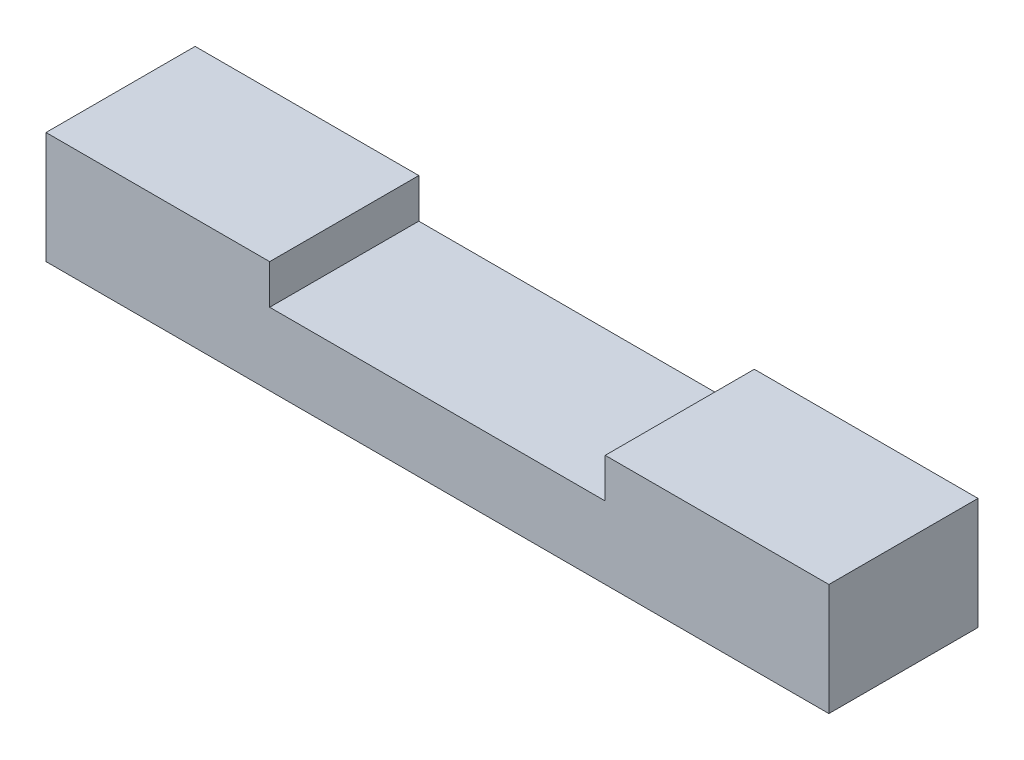
ISO-10303-21;
HEADER;
FILE_DESCRIPTION(('STEP AP214'),'2;1');
FILE_NAME('part.step','',(''),(''),'','','');
FILE_SCHEMA(('AUTOMOTIVE_DESIGN { 1 0 10303 214 1 1 1 1 }'));
ENDSEC;
DATA;
#1=APPLICATION_CONTEXT('core data for automotive mechanical design processes');
#2=APPLICATION_PROTOCOL_DEFINITION('international standard','automotive_design',2000,#1);
#3=PRODUCT_CONTEXT('',#1,'mechanical');
#4=PRODUCT('Part','Part','',(#3));
#5=PRODUCT_RELATED_PRODUCT_CATEGORY('part','',(#4));
#6=PRODUCT_DEFINITION_FORMATION('','',#4);
#7=PRODUCT_DEFINITION_CONTEXT('part definition',#1,'design');
#8=PRODUCT_DEFINITION('design','',#6,#7);
#9=PRODUCT_DEFINITION_SHAPE('','',#8);
#10=(LENGTH_UNIT() NAMED_UNIT(*) SI_UNIT(.MILLI.,.METRE.));
#11=(NAMED_UNIT(*) PLANE_ANGLE_UNIT() SI_UNIT($,.RADIAN.));
#12=(NAMED_UNIT(*) SI_UNIT($,.STERADIAN.) SOLID_ANGLE_UNIT());
#13=UNCERTAINTY_MEASURE_WITH_UNIT(LENGTH_MEASURE(1.E-05),#10,'distance_accuracy_value','');
#14=(GEOMETRIC_REPRESENTATION_CONTEXT(3) GLOBAL_UNCERTAINTY_ASSIGNED_CONTEXT((#13)) GLOBAL_UNIT_ASSIGNED_CONTEXT((#10,
#11,#12)) REPRESENTATION_CONTEXT('',''));
#15=CARTESIAN_POINT('',(0.,0.,0.));
#16=DIRECTION('',(0.,0.,1.));
#17=DIRECTION('',(1.,0.,0.));
#18=AXIS2_PLACEMENT_3D('',#15,#16,#17);
#19=CARTESIAN_POINT('',(0.,150.,200.));
#20=DIRECTION('',(1.,0.,0.));
#21=DIRECTION('',(0.,0.,-1.));
#22=AXIS2_PLACEMENT_3D('',#19,#20,#21);
#23=PLANE('',#22);
#24=DIRECTION('',(0.,-1.,0.));
#25=VECTOR('',#24,1.);
#26=CARTESIAN_POINT('',(0.,150.,0.));
#27=LINE('',#26,#25);
#28=CARTESIAN_POINT('',(0.,150.,0.));
#29=VERTEX_POINT('',#28);
#30=CARTESIAN_POINT('',(0.,0.,0.));
#31=VERTEX_POINT('',#30);
#32=EDGE_CURVE('E128',#29,#31,#27,.T.);
#33=ORIENTED_EDGE('',*,*,#32,.T.);
#34=DIRECTION('',(0.,0.,-1.));
#35=VECTOR('',#34,1.);
#36=CARTESIAN_POINT('',(0.,0.,200.));
#37=LINE('',#36,#35);
#38=CARTESIAN_POINT('',(0.,0.,200.));
#39=VERTEX_POINT('',#38);
#40=EDGE_CURVE('E11',#39,#31,#37,.T.);
#41=ORIENTED_EDGE('',*,*,#40,.F.);
#42=DIRECTION('',(0.,-1.,0.));
#43=VECTOR('',#42,1.);
#44=CARTESIAN_POINT('',(0.,150.,200.));
#45=LINE('',#44,#43);
#46=CARTESIAN_POINT('',(0.,150.,200.));
#47=VERTEX_POINT('',#46);
#48=EDGE_CURVE('E142',#47,#39,#45,.T.);
#49=ORIENTED_EDGE('',*,*,#48,.F.);
#50=DIRECTION('',(0.,0.,-1.));
#51=VECTOR('',#50,1.);
#52=CARTESIAN_POINT('',(0.,150.,200.));
#53=LINE('',#52,#51);
#54=EDGE_CURVE('E124',#47,#29,#53,.T.);
#55=ORIENTED_EDGE('',*,*,#54,.T.);
#56=EDGE_LOOP('',(#33,#41,#49,#55));
#57=FACE_BOUND('',#56,.T.);
#58=ADVANCED_FACE('F32',(#57),#23,.F.);
#59=CARTESIAN_POINT('',(0.,0.,200.));
#60=DIRECTION('',(0.,1.,0.));
#61=DIRECTION('',(0.,0.,1.));
#62=AXIS2_PLACEMENT_3D('',#59,#60,#61);
#63=PLANE('',#62);
#64=DIRECTION('',(1.,0.,0.));
#65=VECTOR('',#64,1.);
#66=CARTESIAN_POINT('',(0.,0.,0.));
#67=LINE('',#66,#65);
#68=CARTESIAN_POINT('',(1050.,0.,0.));
#69=VERTEX_POINT('',#68);
#70=EDGE_CURVE('E131',#31,#69,#67,.T.);
#71=ORIENTED_EDGE('',*,*,#70,.T.);
#72=DIRECTION('',(0.,0.,-1.));
#73=VECTOR('',#72,1.);
#74=CARTESIAN_POINT('',(1050.,0.,200.));
#75=LINE('',#74,#73);
#76=CARTESIAN_POINT('',(1050.,0.,200.));
#77=VERTEX_POINT('',#76);
#78=EDGE_CURVE('E40',#77,#69,#75,.T.);
#79=ORIENTED_EDGE('',*,*,#78,.F.);
#80=DIRECTION('',(1.,0.,0.));
#81=VECTOR('',#80,1.);
#82=CARTESIAN_POINT('',(0.,0.,200.));
#83=LINE('',#82,#81);
#84=EDGE_CURVE('E91',#39,#77,#83,.T.);
#85=ORIENTED_EDGE('',*,*,#84,.F.);
#86=ORIENTED_EDGE('',*,*,#40,.T.);
#87=EDGE_LOOP('',(#71,#79,#85,#86));
#88=FACE_BOUND('',#87,.T.);
#89=ADVANCED_FACE('F177',(#88),#63,.F.);
#90=CARTESIAN_POINT('',(1050.,0.,200.));
#91=DIRECTION('',(-1.,0.,0.));
#92=DIRECTION('',(0.,0.,1.));
#93=AXIS2_PLACEMENT_3D('',#90,#91,#92);
#94=PLANE('',#93);
#95=DIRECTION('',(0.,1.,0.));
#96=VECTOR('',#95,1.);
#97=CARTESIAN_POINT('',(1050.,0.,0.));
#98=LINE('',#97,#96);
#99=CARTESIAN_POINT('',(1050.,150.,0.));
#100=VERTEX_POINT('',#99);
#101=EDGE_CURVE('E133',#69,#100,#98,.T.);
#102=ORIENTED_EDGE('',*,*,#101,.T.);
#103=DIRECTION('',(0.,0.,-1.));
#104=VECTOR('',#103,1.);
#105=CARTESIAN_POINT('',(1050.,150.,200.));
#106=LINE('',#105,#104);
#107=CARTESIAN_POINT('',(1050.,150.,200.));
#108=VERTEX_POINT('',#107);
#109=EDGE_CURVE('E149',#108,#100,#106,.T.);
#110=ORIENTED_EDGE('',*,*,#109,.F.);
#111=DIRECTION('',(0.,1.,0.));
#112=VECTOR('',#111,1.);
#113=CARTESIAN_POINT('',(1050.,0.,200.));
#114=LINE('',#113,#112);
#115=EDGE_CURVE('E157',#77,#108,#114,.T.);
#116=ORIENTED_EDGE('',*,*,#115,.F.);
#117=ORIENTED_EDGE('',*,*,#78,.T.);
#118=EDGE_LOOP('',(#102,#110,#116,#117));
#119=FACE_BOUND('',#118,.T.);
#120=ADVANCED_FACE('F155',(#119),#94,.F.);
#121=CARTESIAN_POINT('',(1050.,150.,200.));
#122=DIRECTION('',(0.,-1.,0.));
#123=DIRECTION('',(0.,0.,-1.));
#124=AXIS2_PLACEMENT_3D('',#121,#122,#123);
#125=PLANE('',#124);
#126=DIRECTION('',(-1.,0.,0.));
#127=VECTOR('',#126,1.);
#128=CARTESIAN_POINT('',(1050.,150.,0.));
#129=LINE('',#128,#127);
#130=CARTESIAN_POINT('',(750.,150.,0.));
#131=VERTEX_POINT('',#130);
#132=EDGE_CURVE('E135',#100,#131,#129,.T.);
#133=ORIENTED_EDGE('',*,*,#132,.T.);
#134=DIRECTION('',(0.,0.,-1.));
#135=VECTOR('',#134,1.);
#136=CARTESIAN_POINT('',(750.,150.,200.));
#137=LINE('',#136,#135);
#138=CARTESIAN_POINT('',(750.,150.,200.));
#139=VERTEX_POINT('',#138);
#140=EDGE_CURVE('E146',#139,#131,#137,.T.);
#141=ORIENTED_EDGE('',*,*,#140,.F.);
#142=DIRECTION('',(-1.,0.,0.));
#143=VECTOR('',#142,1.);
#144=CARTESIAN_POINT('',(1050.,150.,200.));
#145=LINE('',#144,#143);
#146=EDGE_CURVE('E169',#108,#139,#145,.T.);
#147=ORIENTED_EDGE('',*,*,#146,.F.);
#148=ORIENTED_EDGE('',*,*,#109,.T.);
#149=EDGE_LOOP('',(#133,#141,#147,#148));
#150=FACE_BOUND('',#149,.T.);
#151=ADVANCED_FACE('F165',(#150),#125,.F.);
#152=CARTESIAN_POINT('',(750.,150.,200.));
#153=DIRECTION('',(1.,0.,0.));
#154=DIRECTION('',(0.,0.,-1.));
#155=AXIS2_PLACEMENT_3D('',#152,#153,#154);
#156=PLANE('',#155);
#157=DIRECTION('',(0.,-1.,0.));
#158=VECTOR('',#157,1.);
#159=CARTESIAN_POINT('',(750.,150.,0.));
#160=LINE('',#159,#158);
#161=CARTESIAN_POINT('',(750.,97.,0.));
#162=VERTEX_POINT('',#161);
#163=EDGE_CURVE('E137',#131,#162,#160,.T.);
#164=ORIENTED_EDGE('',*,*,#163,.T.);
#165=DIRECTION('',(0.,0.,-1.));
#166=VECTOR('',#165,1.);
#167=CARTESIAN_POINT('',(750.,97.,200.));
#168=LINE('',#167,#166);
#169=CARTESIAN_POINT('',(750.,97.,200.));
#170=VERTEX_POINT('',#169);
#171=EDGE_CURVE('E119',#170,#162,#168,.T.);
#172=ORIENTED_EDGE('',*,*,#171,.F.);
#173=DIRECTION('',(0.,-1.,0.));
#174=VECTOR('',#173,1.);
#175=CARTESIAN_POINT('',(750.,150.,200.));
#176=LINE('',#175,#174);
#177=EDGE_CURVE('E110',#139,#170,#176,.T.);
#178=ORIENTED_EDGE('',*,*,#177,.F.);
#179=ORIENTED_EDGE('',*,*,#140,.T.);
#180=EDGE_LOOP('',(#164,#172,#178,#179));
#181=FACE_BOUND('',#180,.T.);
#182=ADVANCED_FACE('F168',(#181),#156,.F.);
#183=CARTESIAN_POINT('',(750.,97.,200.));
#184=DIRECTION('',(0.,-1.,0.));
#185=DIRECTION('',(0.,0.,-1.));
#186=AXIS2_PLACEMENT_3D('',#183,#184,#185);
#187=PLANE('',#186);
#188=DIRECTION('',(-1.,0.,0.));
#189=VECTOR('',#188,1.);
#190=CARTESIAN_POINT('',(750.,97.,0.));
#191=LINE('',#190,#189);
#192=CARTESIAN_POINT('',(300.,97.,0.));
#193=VERTEX_POINT('',#192);
#194=EDGE_CURVE('E118',#162,#193,#191,.T.);
#195=ORIENTED_EDGE('',*,*,#194,.T.);
#196=DIRECTION('',(0.,0.,-1.));
#197=VECTOR('',#196,1.);
#198=CARTESIAN_POINT('',(300.,97.,200.));
#199=LINE('',#198,#197);
#200=CARTESIAN_POINT('',(300.,97.,200.));
#201=VERTEX_POINT('',#200);
#202=EDGE_CURVE('E115',#201,#193,#199,.T.);
#203=ORIENTED_EDGE('',*,*,#202,.F.);
#204=DIRECTION('',(-1.,0.,0.));
#205=VECTOR('',#204,1.);
#206=CARTESIAN_POINT('',(750.,97.,200.));
#207=LINE('',#206,#205);
#208=EDGE_CURVE('E104',#170,#201,#207,.T.);
#209=ORIENTED_EDGE('',*,*,#208,.F.);
#210=ORIENTED_EDGE('',*,*,#171,.T.);
#211=EDGE_LOOP('',(#195,#203,#209,#210));
#212=FACE_BOUND('',#211,.T.);
#213=ADVANCED_FACE('F116',(#212),#187,.F.);
#214=CARTESIAN_POINT('',(300.,97.,200.));
#215=DIRECTION('',(-1.,0.,0.));
#216=DIRECTION('',(0.,0.,1.));
#217=AXIS2_PLACEMENT_3D('',#214,#215,#216);
#218=PLANE('',#217);
#219=DIRECTION('',(0.,1.,0.));
#220=VECTOR('',#219,1.);
#221=CARTESIAN_POINT('',(300.,97.,0.));
#222=LINE('',#221,#220);
#223=CARTESIAN_POINT('',(300.,150.,0.));
#224=VERTEX_POINT('',#223);
#225=EDGE_CURVE('E77',#193,#224,#222,.T.);
#226=ORIENTED_EDGE('',*,*,#225,.T.);
#227=DIRECTION('',(0.,0.,-1.));
#228=VECTOR('',#227,1.);
#229=CARTESIAN_POINT('',(300.,150.,200.));
#230=LINE('',#229,#228);
#231=CARTESIAN_POINT('',(300.,150.,200.));
#232=VERTEX_POINT('',#231);
#233=EDGE_CURVE('E120',#232,#224,#230,.T.);
#234=ORIENTED_EDGE('',*,*,#233,.F.);
#235=DIRECTION('',(0.,1.,0.));
#236=VECTOR('',#235,1.);
#237=CARTESIAN_POINT('',(300.,97.,200.));
#238=LINE('',#237,#236);
#239=EDGE_CURVE('E108',#201,#232,#238,.T.);
#240=ORIENTED_EDGE('',*,*,#239,.F.);
#241=ORIENTED_EDGE('',*,*,#202,.T.);
#242=EDGE_LOOP('',(#226,#234,#240,#241));
#243=FACE_BOUND('',#242,.T.);
#244=ADVANCED_FACE('F122',(#243),#218,.F.);
#245=CARTESIAN_POINT('',(300.,150.,200.));
#246=DIRECTION('',(0.,-1.,0.));
#247=DIRECTION('',(1.,0.,0.));
#248=AXIS2_PLACEMENT_3D('',#245,#246,#247);
#249=PLANE('',#248);
#250=DIRECTION('',(-1.,0.,0.));
#251=VECTOR('',#250,1.);
#252=CARTESIAN_POINT('',(300.,150.,0.));
#253=LINE('',#252,#251);
#254=EDGE_CURVE('E83',#224,#29,#253,.T.);
#255=ORIENTED_EDGE('',*,*,#254,.T.);
#256=ORIENTED_EDGE('',*,*,#54,.F.);
#257=DIRECTION('',(-1.,0.,0.));
#258=VECTOR('',#257,1.);
#259=CARTESIAN_POINT('',(300.,150.,200.));
#260=LINE('',#259,#258);
#261=EDGE_CURVE('E48',#232,#47,#260,.T.);
#262=ORIENTED_EDGE('',*,*,#261,.F.);
#263=ORIENTED_EDGE('',*,*,#233,.T.);
#264=EDGE_LOOP('',(#255,#256,#262,#263));
#265=FACE_BOUND('',#264,.T.);
#266=ADVANCED_FACE('F193',(#265),#249,.F.);
#267=CARTESIAN_POINT('',(0.,0.,200.));
#268=DIRECTION('',(0.,0.,1.));
#269=DIRECTION('',(1.,0.,0.));
#270=AXIS2_PLACEMENT_3D('',#267,#268,#269);
#271=PLANE('',#270);
#272=ORIENTED_EDGE('',*,*,#48,.T.);
#273=ORIENTED_EDGE('',*,*,#84,.T.);
#274=ORIENTED_EDGE('',*,*,#115,.T.);
#275=ORIENTED_EDGE('',*,*,#146,.T.);
#276=ORIENTED_EDGE('',*,*,#177,.T.);
#277=ORIENTED_EDGE('',*,*,#208,.T.);
#278=ORIENTED_EDGE('',*,*,#239,.T.);
#279=ORIENTED_EDGE('',*,*,#261,.T.);
#280=EDGE_LOOP('',(#272,#273,#274,#275,#276,#277,#278,#279));
#281=FACE_BOUND('',#280,.T.);
#282=ADVANCED_FACE('F106',(#281),#271,.T.);
#283=CARTESIAN_POINT('',(0.,0.,0.));
#284=DIRECTION('',(0.,0.,1.));
#285=DIRECTION('',(1.,0.,0.));
#286=AXIS2_PLACEMENT_3D('',#283,#284,#285);
#287=PLANE('',#286);
#288=ORIENTED_EDGE('',*,*,#32,.F.);
#289=ORIENTED_EDGE('',*,*,#254,.F.);
#290=ORIENTED_EDGE('',*,*,#225,.F.);
#291=ORIENTED_EDGE('',*,*,#194,.F.);
#292=ORIENTED_EDGE('',*,*,#163,.F.);
#293=ORIENTED_EDGE('',*,*,#132,.F.);
#294=ORIENTED_EDGE('',*,*,#101,.F.);
#295=ORIENTED_EDGE('',*,*,#70,.F.);
#296=EDGE_LOOP('',(#288,#289,#290,#291,#292,#293,#294,#295));
#297=FACE_BOUND('',#296,.T.);
#298=ADVANCED_FACE('F161',(#297),#287,.F.);
#299=CLOSED_SHELL('',(#58,#89,#120,#151,#182,#213,#244,#266,#282,#298));
#300=MANIFOLD_SOLID_BREP('B2',#299);
#301=ADVANCED_BREP_SHAPE_REPRESENTATION('',(#18,#300),#14);
#302=SHAPE_DEFINITION_REPRESENTATION(#9,#301);
ENDSEC;
END-ISO-10303-21;
